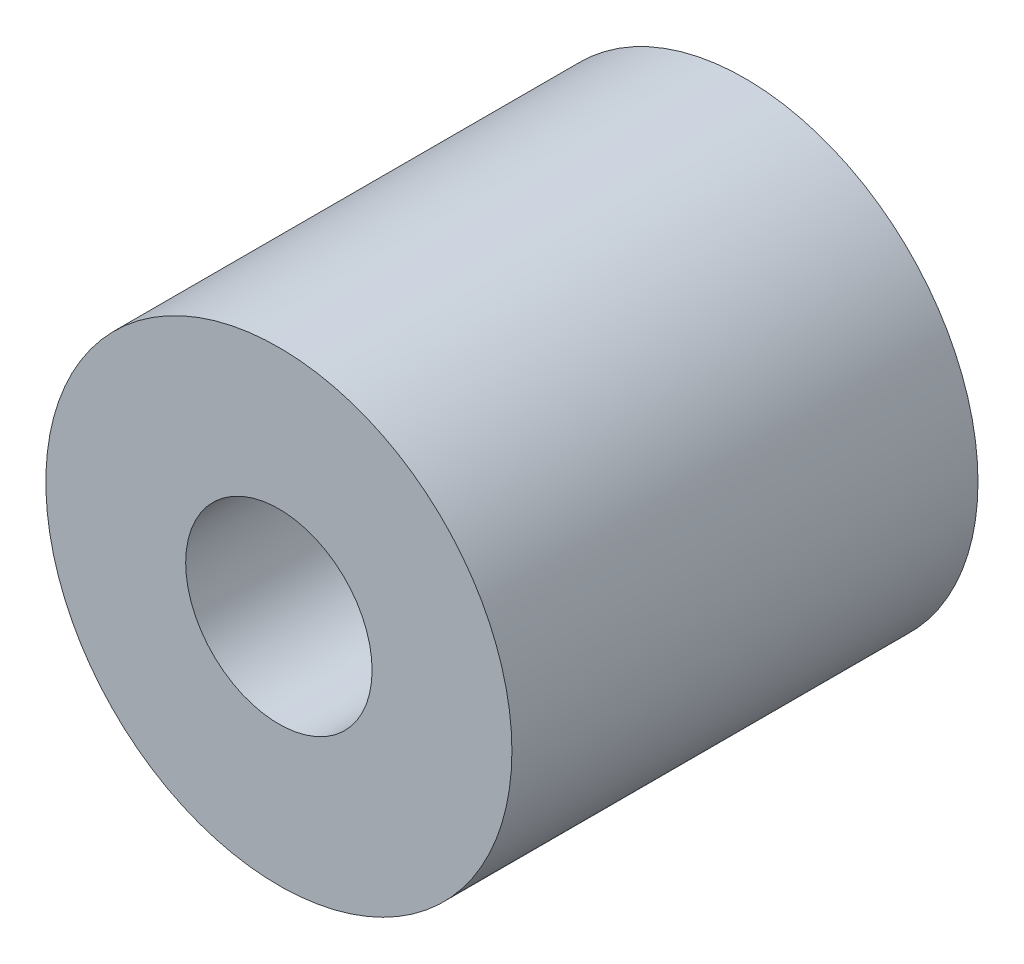
ISO-10303-21;
HEADER;
FILE_DESCRIPTION(('STEP AP214'),'2;1');
FILE_NAME('part.step','',(''),(''),'','','');
FILE_SCHEMA(('AUTOMOTIVE_DESIGN { 1 0 10303 214 1 1 1 1 }'));
ENDSEC;
DATA;
#1=APPLICATION_CONTEXT('core data for automotive mechanical design processes');
#2=APPLICATION_PROTOCOL_DEFINITION('international standard','automotive_design',2000,#1);
#3=PRODUCT_CONTEXT('',#1,'mechanical');
#4=PRODUCT('Part','Part','',(#3));
#5=PRODUCT_RELATED_PRODUCT_CATEGORY('part','',(#4));
#6=PRODUCT_DEFINITION_FORMATION('','',#4);
#7=PRODUCT_DEFINITION_CONTEXT('part definition',#1,'design');
#8=PRODUCT_DEFINITION('design','',#6,#7);
#9=PRODUCT_DEFINITION_SHAPE('','',#8);
#10=(LENGTH_UNIT() NAMED_UNIT(*) SI_UNIT(.MILLI.,.METRE.));
#11=(NAMED_UNIT(*) PLANE_ANGLE_UNIT() SI_UNIT($,.RADIAN.));
#12=(NAMED_UNIT(*) SI_UNIT($,.STERADIAN.) SOLID_ANGLE_UNIT());
#13=UNCERTAINTY_MEASURE_WITH_UNIT(LENGTH_MEASURE(1.E-05),#10,'distance_accuracy_value','');
#14=(GEOMETRIC_REPRESENTATION_CONTEXT(3) GLOBAL_UNCERTAINTY_ASSIGNED_CONTEXT((#13)) GLOBAL_UNIT_ASSIGNED_CONTEXT((#10,
#11,#12)) REPRESENTATION_CONTEXT('',''));
#15=CARTESIAN_POINT('',(0.,0.,0.));
#16=DIRECTION('',(0.,0.,1.));
#17=DIRECTION('',(1.,0.,0.));
#18=AXIS2_PLACEMENT_3D('',#15,#16,#17);
#19=CARTESIAN_POINT('',(0.,0.,8.));
#20=DIRECTION('',(0.,0.,1.));
#21=DIRECTION('',(1.,0.,0.));
#22=AXIS2_PLACEMENT_3D('',#19,#20,#21);
#23=PLANE('',#22);
#24=CARTESIAN_POINT('',(0.,0.,8.));
#25=DIRECTION('',(0.,0.,1.));
#26=DIRECTION('',(1.,0.,0.));
#27=AXIS2_PLACEMENT_3D('',#24,#25,#26);
#28=CIRCLE('',#27,4.);
#29=CARTESIAN_POINT('',(4.,0.,8.));
#30=VERTEX_POINT('',#29);
#31=EDGE_CURVE('E10',#30,#30,#28,.T.);
#32=ORIENTED_EDGE('',*,*,#31,.T.);
#33=EDGE_LOOP('',(#32));
#34=FACE_BOUND('',#33,.T.);
#35=CARTESIAN_POINT('',(0.,0.,8.));
#36=DIRECTION('',(0.,0.,1.));
#37=DIRECTION('',(1.,0.,0.));
#38=AXIS2_PLACEMENT_3D('',#35,#36,#37);
#39=CIRCLE('',#38,1.6);
#40=CARTESIAN_POINT('',(1.6,0.,8.));
#41=VERTEX_POINT('',#40);
#42=EDGE_CURVE('E41',#41,#41,#39,.T.);
#43=ORIENTED_EDGE('',*,*,#42,.F.);
#44=EDGE_LOOP('',(#43));
#45=FACE_BOUND('',#44,.T.);
#46=ADVANCED_FACE('F30',(#34,#45),#23,.T.);
#47=CARTESIAN_POINT('',(0.,0.,0.));
#48=DIRECTION('',(0.,0.,1.));
#49=DIRECTION('',(1.,0.,0.));
#50=AXIS2_PLACEMENT_3D('',#47,#48,#49);
#51=PLANE('',#50);
#52=CARTESIAN_POINT('',(0.,0.,0.));
#53=DIRECTION('',(0.,0.,1.));
#54=DIRECTION('',(1.,0.,0.));
#55=AXIS2_PLACEMENT_3D('',#52,#53,#54);
#56=CIRCLE('',#55,4.);
#57=CARTESIAN_POINT('',(4.,0.,0.));
#58=VERTEX_POINT('',#57);
#59=EDGE_CURVE('E34',#58,#58,#56,.T.);
#60=ORIENTED_EDGE('',*,*,#59,.F.);
#61=EDGE_LOOP('',(#60));
#62=FACE_BOUND('',#61,.T.);
#63=CARTESIAN_POINT('',(0.,0.,0.));
#64=DIRECTION('',(0.,0.,1.));
#65=DIRECTION('',(1.,0.,0.));
#66=AXIS2_PLACEMENT_3D('',#63,#64,#65);
#67=CIRCLE('',#66,1.6);
#68=CARTESIAN_POINT('',(1.6,0.,0.));
#69=VERTEX_POINT('',#68);
#70=EDGE_CURVE('E43',#69,#69,#67,.T.);
#71=ORIENTED_EDGE('',*,*,#70,.T.);
#72=EDGE_LOOP('',(#71));
#73=FACE_BOUND('',#72,.T.);
#74=ADVANCED_FACE('F53',(#62,#73),#51,.F.);
#75=CARTESIAN_POINT('',(0.,0.,8.));
#76=DIRECTION('',(0.,0.,-1.));
#77=DIRECTION('',(-1.,0.,0.));
#78=AXIS2_PLACEMENT_3D('',#75,#76,#77);
#79=CYLINDRICAL_SURFACE('',#78,4.);
#80=ORIENTED_EDGE('',*,*,#31,.F.);
#81=EDGE_LOOP('',(#80));
#82=FACE_BOUND('',#81,.T.);
#83=ORIENTED_EDGE('',*,*,#59,.T.);
#84=EDGE_LOOP('',(#83));
#85=FACE_BOUND('',#84,.T.);
#86=ADVANCED_FACE('F32',(#82,#85),#79,.T.);
#87=CARTESIAN_POINT('',(0.,0.,8.));
#88=DIRECTION('',(0.,0.,-1.));
#89=DIRECTION('',(-1.,0.,0.));
#90=AXIS2_PLACEMENT_3D('',#87,#88,#89);
#91=CYLINDRICAL_SURFACE('',#90,1.6);
#92=ORIENTED_EDGE('',*,*,#42,.T.);
#93=EDGE_LOOP('',(#92));
#94=FACE_BOUND('',#93,.T.);
#95=ORIENTED_EDGE('',*,*,#70,.F.);
#96=EDGE_LOOP('',(#95));
#97=FACE_BOUND('',#96,.T.);
#98=ADVANCED_FACE('F49',(#94,#97),#91,.F.);
#99=CLOSED_SHELL('',(#46,#74,#86,#98));
#100=MANIFOLD_SOLID_BREP('B2',#99);
#101=ADVANCED_BREP_SHAPE_REPRESENTATION('',(#18,#100),#14);
#102=SHAPE_DEFINITION_REPRESENTATION(#9,#101);
ENDSEC;
END-ISO-10303-21;
